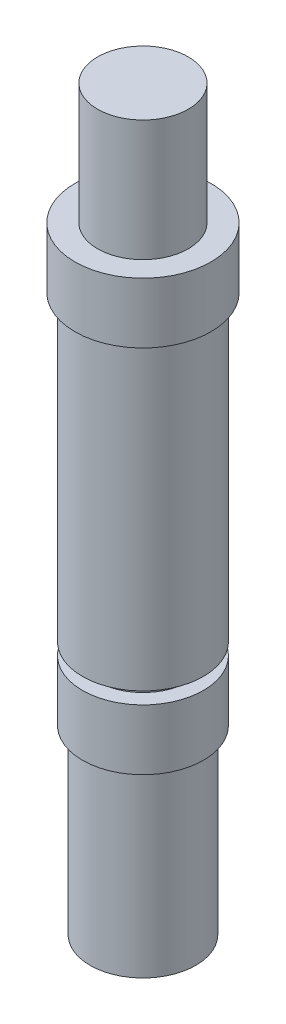
ISO-10303-21;
HEADER;
FILE_DESCRIPTION(('STEP AP214'),'2;1');
FILE_NAME('part.step','',(''),(''),'','','');
FILE_SCHEMA(('AUTOMOTIVE_DESIGN { 1 0 10303 214 1 1 1 1 }'));
ENDSEC;
DATA;
#1=APPLICATION_CONTEXT('core data for automotive mechanical design processes');
#2=APPLICATION_PROTOCOL_DEFINITION('international standard','automotive_design',2000,#1);
#3=PRODUCT_CONTEXT('',#1,'mechanical');
#4=PRODUCT('Part','Part','',(#3));
#5=PRODUCT_RELATED_PRODUCT_CATEGORY('part','',(#4));
#6=PRODUCT_DEFINITION_FORMATION('','',#4);
#7=PRODUCT_DEFINITION_CONTEXT('part definition',#1,'design');
#8=PRODUCT_DEFINITION('design','',#6,#7);
#9=PRODUCT_DEFINITION_SHAPE('','',#8);
#10=(LENGTH_UNIT() NAMED_UNIT(*) SI_UNIT(.MILLI.,.METRE.));
#11=(NAMED_UNIT(*) PLANE_ANGLE_UNIT() SI_UNIT($,.RADIAN.));
#12=(NAMED_UNIT(*) SI_UNIT($,.STERADIAN.) SOLID_ANGLE_UNIT());
#13=UNCERTAINTY_MEASURE_WITH_UNIT(LENGTH_MEASURE(1.E-05),#10,'distance_accuracy_value','');
#14=(GEOMETRIC_REPRESENTATION_CONTEXT(3) GLOBAL_UNCERTAINTY_ASSIGNED_CONTEXT((#13)) GLOBAL_UNIT_ASSIGNED_CONTEXT((#10,
#11,#12)) REPRESENTATION_CONTEXT('',''));
#15=CARTESIAN_POINT('',(0.,0.,0.));
#16=DIRECTION('',(0.,0.,1.));
#17=DIRECTION('',(1.,0.,0.));
#18=AXIS2_PLACEMENT_3D('',#15,#16,#17);
#19=CARTESIAN_POINT('',(0.,60.,0.));
#20=DIRECTION('',(0.,-1.,0.));
#21=DIRECTION('',(0.,0.,-1.));
#22=AXIS2_PLACEMENT_3D('',#19,#20,#21);
#23=CYLINDRICAL_SURFACE('',#22,17.5);
#24=CARTESIAN_POINT('',(0.,60.,0.));
#25=DIRECTION('',(0.,1.,0.));
#26=DIRECTION('',(0.,0.,1.));
#27=AXIS2_PLACEMENT_3D('',#24,#25,#26);
#28=CIRCLE('',#27,17.5);
#29=CARTESIAN_POINT('',(0.,60.,17.5));
#30=VERTEX_POINT('',#29);
#31=EDGE_CURVE('E54',#30,#30,#28,.T.);
#32=ORIENTED_EDGE('',*,*,#31,.F.);
#33=EDGE_LOOP('',(#32));
#34=FACE_BOUND('',#33,.T.);
#35=CARTESIAN_POINT('',(0.,0.,0.));
#36=DIRECTION('',(0.,1.,0.));
#37=DIRECTION('',(0.,0.,1.));
#38=AXIS2_PLACEMENT_3D('',#35,#36,#37);
#39=CIRCLE('',#38,17.5);
#40=CARTESIAN_POINT('',(0.,0.,17.5));
#41=VERTEX_POINT('',#40);
#42=EDGE_CURVE('E42',#41,#41,#39,.T.);
#43=ORIENTED_EDGE('',*,*,#42,.T.);
#44=EDGE_LOOP('',(#43));
#45=FACE_BOUND('',#44,.T.);
#46=ADVANCED_FACE('F39',(#34,#45),#23,.T.);
#47=CARTESIAN_POINT('',(0.,0.,0.));
#48=DIRECTION('',(0.,1.,0.));
#49=DIRECTION('',(0.,0.,1.));
#50=AXIS2_PLACEMENT_3D('',#47,#48,#49);
#51=PLANE('',#50);
#52=ORIENTED_EDGE('',*,*,#42,.F.);
#53=EDGE_LOOP('',(#52));
#54=FACE_BOUND('',#53,.T.);
#55=ADVANCED_FACE('F97',(#54),#51,.F.);
#56=CARTESIAN_POINT('',(0.,80.,0.));
#57=DIRECTION('',(0.,-1.,0.));
#58=DIRECTION('',(0.,0.,-1.));
#59=AXIS2_PLACEMENT_3D('',#56,#57,#58);
#60=CYLINDRICAL_SURFACE('',#59,20.);
#61=CARTESIAN_POINT('',(0.,80.,0.));
#62=DIRECTION('',(0.,1.,0.));
#63=DIRECTION('',(0.,0.,1.));
#64=AXIS2_PLACEMENT_3D('',#61,#62,#63);
#65=CIRCLE('',#64,20.);
#66=CARTESIAN_POINT('',(0.,80.,20.));
#67=VERTEX_POINT('',#66);
#68=EDGE_CURVE('E80',#67,#67,#65,.T.);
#69=ORIENTED_EDGE('',*,*,#68,.F.);
#70=EDGE_LOOP('',(#69));
#71=FACE_BOUND('',#70,.T.);
#72=CARTESIAN_POINT('',(0.,60.,0.));
#73=DIRECTION('',(0.,1.,0.));
#74=DIRECTION('',(0.,0.,1.));
#75=AXIS2_PLACEMENT_3D('',#72,#73,#74);
#76=CIRCLE('',#75,20.);
#77=CARTESIAN_POINT('',(0.,60.,20.));
#78=VERTEX_POINT('',#77);
#79=EDGE_CURVE('E78',#78,#78,#76,.T.);
#80=ORIENTED_EDGE('',*,*,#79,.T.);
#81=EDGE_LOOP('',(#80));
#82=FACE_BOUND('',#81,.T.);
#83=ADVANCED_FACE('F99',(#71,#82),#60,.T.);
#84=CARTESIAN_POINT('',(0.,80.,0.));
#85=DIRECTION('',(0.,1.,0.));
#86=DIRECTION('',(0.,0.,1.));
#87=AXIS2_PLACEMENT_3D('',#84,#85,#86);
#88=PLANE('',#87);
#89=CARTESIAN_POINT('',(0.,80.,0.));
#90=DIRECTION('',(0.,1.,0.));
#91=DIRECTION('',(0.,0.,1.));
#92=AXIS2_PLACEMENT_3D('',#89,#90,#91);
#93=CIRCLE('',#92,15.);
#94=CARTESIAN_POINT('',(0.,80.,15.));
#95=VERTEX_POINT('',#94);
#96=EDGE_CURVE('E47',#95,#95,#93,.T.);
#97=ORIENTED_EDGE('',*,*,#96,.F.);
#98=EDGE_LOOP('',(#97));
#99=FACE_BOUND('',#98,.T.);
#100=ORIENTED_EDGE('',*,*,#68,.T.);
#101=EDGE_LOOP('',(#100));
#102=FACE_BOUND('',#101,.T.);
#103=ADVANCED_FACE('F104',(#99,#102),#88,.T.);
#104=CARTESIAN_POINT('',(0.,60.,0.));
#105=DIRECTION('',(0.,1.,0.));
#106=DIRECTION('',(0.,0.,1.));
#107=AXIS2_PLACEMENT_3D('',#104,#105,#106);
#108=PLANE('',#107);
#109=ORIENTED_EDGE('',*,*,#31,.T.);
#110=EDGE_LOOP('',(#109));
#111=FACE_BOUND('',#110,.T.);
#112=ORIENTED_EDGE('',*,*,#79,.F.);
#113=EDGE_LOOP('',(#112));
#114=FACE_BOUND('',#113,.T.);
#115=ADVANCED_FACE('F109',(#111,#114),#108,.F.);
#116=CARTESIAN_POINT('',(0.,84.,0.));
#117=DIRECTION('',(0.,-1.,0.));
#118=DIRECTION('',(0.,0.,-1.));
#119=AXIS2_PLACEMENT_3D('',#116,#117,#118);
#120=CYLINDRICAL_SURFACE('',#119,15.);
#121=CARTESIAN_POINT('',(0.,84.,0.));
#122=DIRECTION('',(0.,1.,0.));
#123=DIRECTION('',(0.,0.,1.));
#124=AXIS2_PLACEMENT_3D('',#121,#122,#123);
#125=CIRCLE('',#124,15.);
#126=CARTESIAN_POINT('',(0.,84.,15.));
#127=VERTEX_POINT('',#126);
#128=EDGE_CURVE('E72',#127,#127,#125,.T.);
#129=ORIENTED_EDGE('',*,*,#128,.F.);
#130=EDGE_LOOP('',(#129));
#131=FACE_BOUND('',#130,.T.);
#132=ORIENTED_EDGE('',*,*,#96,.T.);
#133=EDGE_LOOP('',(#132));
#134=FACE_BOUND('',#133,.T.);
#135=ADVANCED_FACE('F112',(#131,#134),#120,.T.);
#136=CARTESIAN_POINT('',(0.,184.,0.));
#137=DIRECTION('',(0.,-1.,0.));
#138=DIRECTION('',(0.,0.,-1.));
#139=AXIS2_PLACEMENT_3D('',#136,#137,#138);
#140=CYLINDRICAL_SURFACE('',#139,20.);
#141=CARTESIAN_POINT('',(0.,184.,0.));
#142=DIRECTION('',(0.,1.,0.));
#143=DIRECTION('',(0.,0.,1.));
#144=AXIS2_PLACEMENT_3D('',#141,#142,#143);
#145=CIRCLE('',#144,20.);
#146=CARTESIAN_POINT('',(0.,184.,20.));
#147=VERTEX_POINT('',#146);
#148=EDGE_CURVE('E68',#147,#147,#145,.T.);
#149=ORIENTED_EDGE('',*,*,#148,.F.);
#150=EDGE_LOOP('',(#149));
#151=FACE_BOUND('',#150,.T.);
#152=CARTESIAN_POINT('',(0.,84.,0.));
#153=DIRECTION('',(0.,1.,0.));
#154=DIRECTION('',(0.,0.,1.));
#155=AXIS2_PLACEMENT_3D('',#152,#153,#154);
#156=CIRCLE('',#155,20.);
#157=CARTESIAN_POINT('',(0.,84.,20.));
#158=VERTEX_POINT('',#157);
#159=EDGE_CURVE('E63',#158,#158,#156,.T.);
#160=ORIENTED_EDGE('',*,*,#159,.T.);
#161=EDGE_LOOP('',(#160));
#162=FACE_BOUND('',#161,.T.);
#163=ADVANCED_FACE('F118',(#151,#162),#140,.T.);
#164=CARTESIAN_POINT('',(0.,84.,0.));
#165=DIRECTION('',(0.,1.,0.));
#166=DIRECTION('',(0.,0.,1.));
#167=AXIS2_PLACEMENT_3D('',#164,#165,#166);
#168=PLANE('',#167);
#169=ORIENTED_EDGE('',*,*,#128,.T.);
#170=EDGE_LOOP('',(#169));
#171=FACE_BOUND('',#170,.T.);
#172=ORIENTED_EDGE('',*,*,#159,.F.);
#173=EDGE_LOOP('',(#172));
#174=FACE_BOUND('',#173,.T.);
#175=ADVANCED_FACE('F122',(#171,#174),#168,.F.);
#176=CARTESIAN_POINT('',(0.,204.,0.));
#177=DIRECTION('',(0.,-1.,0.));
#178=DIRECTION('',(0.,0.,-1.));
#179=AXIS2_PLACEMENT_3D('',#176,#177,#178);
#180=CYLINDRICAL_SURFACE('',#179,22.5);
#181=CARTESIAN_POINT('',(0.,204.,0.));
#182=DIRECTION('',(0.,1.,0.));
#183=DIRECTION('',(0.,0.,1.));
#184=AXIS2_PLACEMENT_3D('',#181,#182,#183);
#185=CIRCLE('',#184,22.5);
#186=CARTESIAN_POINT('',(0.,204.,22.5));
#187=VERTEX_POINT('',#186);
#188=EDGE_CURVE('E59',#187,#187,#185,.T.);
#189=ORIENTED_EDGE('',*,*,#188,.F.);
#190=EDGE_LOOP('',(#189));
#191=FACE_BOUND('',#190,.T.);
#192=CARTESIAN_POINT('',(0.,184.,0.));
#193=DIRECTION('',(0.,1.,0.));
#194=DIRECTION('',(0.,0.,1.));
#195=AXIS2_PLACEMENT_3D('',#192,#193,#194);
#196=CIRCLE('',#195,22.5);
#197=CARTESIAN_POINT('',(0.,184.,22.5));
#198=VERTEX_POINT('',#197);
#199=EDGE_CURVE('E64',#198,#198,#196,.T.);
#200=ORIENTED_EDGE('',*,*,#199,.T.);
#201=EDGE_LOOP('',(#200));
#202=FACE_BOUND('',#201,.T.);
#203=ADVANCED_FACE('F126',(#191,#202),#180,.T.);
#204=CARTESIAN_POINT('',(0.,204.,0.));
#205=DIRECTION('',(0.,1.,0.));
#206=DIRECTION('',(0.,0.,1.));
#207=AXIS2_PLACEMENT_3D('',#204,#205,#206);
#208=PLANE('',#207);
#209=CARTESIAN_POINT('',(0.,204.,0.));
#210=DIRECTION('',(0.,1.,0.));
#211=DIRECTION('',(0.,0.,1.));
#212=AXIS2_PLACEMENT_3D('',#209,#210,#211);
#213=CIRCLE('',#212,15.);
#214=CARTESIAN_POINT('',(0.,204.,15.));
#215=VERTEX_POINT('',#214);
#216=EDGE_CURVE('E10',#215,#215,#213,.T.);
#217=ORIENTED_EDGE('',*,*,#216,.F.);
#218=EDGE_LOOP('',(#217));
#219=FACE_BOUND('',#218,.T.);
#220=ORIENTED_EDGE('',*,*,#188,.T.);
#221=EDGE_LOOP('',(#220));
#222=FACE_BOUND('',#221,.T.);
#223=ADVANCED_FACE('F130',(#219,#222),#208,.T.);
#224=CARTESIAN_POINT('',(0.,184.,0.));
#225=DIRECTION('',(0.,1.,0.));
#226=DIRECTION('',(0.,0.,1.));
#227=AXIS2_PLACEMENT_3D('',#224,#225,#226);
#228=PLANE('',#227);
#229=ORIENTED_EDGE('',*,*,#148,.T.);
#230=EDGE_LOOP('',(#229));
#231=FACE_BOUND('',#230,.T.);
#232=ORIENTED_EDGE('',*,*,#199,.F.);
#233=EDGE_LOOP('',(#232));
#234=FACE_BOUND('',#233,.T.);
#235=ADVANCED_FACE('F132',(#231,#234),#228,.F.);
#236=CARTESIAN_POINT('',(0.,244.,0.));
#237=DIRECTION('',(0.,-1.,0.));
#238=DIRECTION('',(0.,0.,-1.));
#239=AXIS2_PLACEMENT_3D('',#236,#237,#238);
#240=CYLINDRICAL_SURFACE('',#239,15.);
#241=CARTESIAN_POINT('',(0.,244.,0.));
#242=DIRECTION('',(0.,1.,0.));
#243=DIRECTION('',(0.,0.,1.));
#244=AXIS2_PLACEMENT_3D('',#241,#242,#243);
#245=CIRCLE('',#244,15.);
#246=CARTESIAN_POINT('',(0.,244.,15.));
#247=VERTEX_POINT('',#246);
#248=EDGE_CURVE('E58',#247,#247,#245,.T.);
#249=ORIENTED_EDGE('',*,*,#248,.F.);
#250=EDGE_LOOP('',(#249));
#251=FACE_BOUND('',#250,.T.);
#252=ORIENTED_EDGE('',*,*,#216,.T.);
#253=EDGE_LOOP('',(#252));
#254=FACE_BOUND('',#253,.T.);
#255=ADVANCED_FACE('F135',(#251,#254),#240,.T.);
#256=CARTESIAN_POINT('',(0.,244.,0.));
#257=DIRECTION('',(0.,1.,0.));
#258=DIRECTION('',(0.,0.,1.));
#259=AXIS2_PLACEMENT_3D('',#256,#257,#258);
#260=PLANE('',#259);
#261=ORIENTED_EDGE('',*,*,#248,.T.);
#262=EDGE_LOOP('',(#261));
#263=FACE_BOUND('',#262,.T.);
#264=ADVANCED_FACE('F142',(#263),#260,.T.);
#265=CLOSED_SHELL('',(#46,#55,#83,#103,#115,#135,#163,#175,#203,#223,#235,#255,#264));
#266=MANIFOLD_SOLID_BREP('B2',#265);
#267=ADVANCED_BREP_SHAPE_REPRESENTATION('',(#18,#266),#14);
#268=SHAPE_DEFINITION_REPRESENTATION(#9,#267);
ENDSEC;
END-ISO-10303-21;
